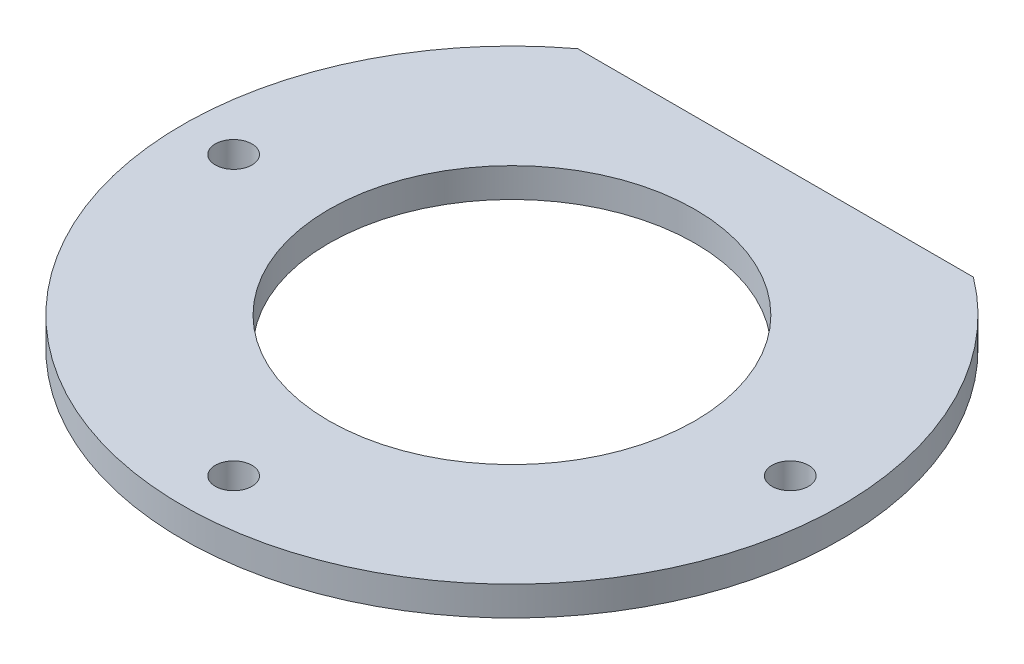
ISO-10303-21;
HEADER;
FILE_DESCRIPTION(('STEP AP214'),'2;1');
FILE_NAME('part.step','',(''),(''),'','','');
FILE_SCHEMA(('AUTOMOTIVE_DESIGN { 1 0 10303 214 1 1 1 1 }'));
ENDSEC;
DATA;
#1=APPLICATION_CONTEXT('core data for automotive mechanical design processes');
#2=APPLICATION_PROTOCOL_DEFINITION('international standard','automotive_design',2000,#1);
#3=PRODUCT_CONTEXT('',#1,'mechanical');
#4=PRODUCT('Part','Part','',(#3));
#5=PRODUCT_RELATED_PRODUCT_CATEGORY('part','',(#4));
#6=PRODUCT_DEFINITION_FORMATION('','',#4);
#7=PRODUCT_DEFINITION_CONTEXT('part definition',#1,'design');
#8=PRODUCT_DEFINITION('design','',#6,#7);
#9=PRODUCT_DEFINITION_SHAPE('','',#8);
#10=(LENGTH_UNIT() NAMED_UNIT(*) SI_UNIT(.MILLI.,.METRE.));
#11=(NAMED_UNIT(*) PLANE_ANGLE_UNIT() SI_UNIT($,.RADIAN.));
#12=(NAMED_UNIT(*) SI_UNIT($,.STERADIAN.) SOLID_ANGLE_UNIT());
#13=UNCERTAINTY_MEASURE_WITH_UNIT(LENGTH_MEASURE(1.E-05),#10,'distance_accuracy_value','');
#14=(GEOMETRIC_REPRESENTATION_CONTEXT(3) GLOBAL_UNCERTAINTY_ASSIGNED_CONTEXT((#13)) GLOBAL_UNIT_ASSIGNED_CONTEXT((#10,
#11,#12)) REPRESENTATION_CONTEXT('',''));
#15=CARTESIAN_POINT('',(0.,0.,0.));
#16=DIRECTION('',(0.,0.,1.));
#17=DIRECTION('',(1.,0.,0.));
#18=AXIS2_PLACEMENT_3D('',#15,#16,#17);
#19=CARTESIAN_POINT('',(0.,2.,0.));
#20=DIRECTION('',(0.,1.,0.));
#21=DIRECTION('',(0.,0.,1.));
#22=AXIS2_PLACEMENT_3D('',#19,#20,#21);
#23=PLANE('',#22);
#24=CARTESIAN_POINT('',(0.,2.,19.));
#25=DIRECTION('',(0.,1.,0.));
#26=DIRECTION('',(0.,0.,1.));
#27=AXIS2_PLACEMENT_3D('',#24,#25,#26);
#28=CIRCLE('',#27,1.25);
#29=CARTESIAN_POINT('',(0.,2.,20.25));
#30=VERTEX_POINT('',#29);
#31=EDGE_CURVE('E91',#30,#30,#28,.T.);
#32=ORIENTED_EDGE('',*,*,#31,.F.);
#33=EDGE_LOOP('',(#32));
#34=FACE_BOUND('',#33,.T.);
#35=CARTESIAN_POINT('',(19.,2.,0.));
#36=DIRECTION('',(0.,1.,0.));
#37=DIRECTION('',(0.,0.,1.));
#38=AXIS2_PLACEMENT_3D('',#35,#36,#37);
#39=CIRCLE('',#38,1.25);
#40=CARTESIAN_POINT('',(19.,2.,1.24999999999999));
#41=VERTEX_POINT('',#40);
#42=EDGE_CURVE('E85',#41,#41,#39,.T.);
#43=ORIENTED_EDGE('',*,*,#42,.F.);
#44=EDGE_LOOP('',(#43));
#45=FACE_BOUND('',#44,.T.);
#46=CARTESIAN_POINT('',(-19.,2.,0.));
#47=DIRECTION('',(0.,1.,0.));
#48=DIRECTION('',(0.,0.,1.));
#49=AXIS2_PLACEMENT_3D('',#46,#47,#48);
#50=CIRCLE('',#49,1.25);
#51=CARTESIAN_POINT('',(-19.,2.,1.24999999999999));
#52=VERTEX_POINT('',#51);
#53=EDGE_CURVE('E79',#52,#52,#50,.T.);
#54=ORIENTED_EDGE('',*,*,#53,.F.);
#55=EDGE_LOOP('',(#54));
#56=FACE_BOUND('',#55,.T.);
#57=DIRECTION('',(1.,0.,0.));
#58=VECTOR('',#57,1.);
#59=CARTESIAN_POINT('',(-20.2349359796307,2.,-18.));
#60=LINE('',#59,#58);
#61=CARTESIAN_POINT('',(-13.5,2.,-18.));
#62=VERTEX_POINT('',#61);
#63=CARTESIAN_POINT('',(13.5,2.,-18.));
#64=VERTEX_POINT('',#63);
#65=EDGE_CURVE('E48',#62,#64,#60,.T.);
#66=ORIENTED_EDGE('',*,*,#65,.F.);
#67=CARTESIAN_POINT('',(0.,2.,0.));
#68=DIRECTION('',(0.,1.,0.));
#69=DIRECTION('',(0.,0.,1.));
#70=AXIS2_PLACEMENT_3D('',#67,#68,#69);
#71=CIRCLE('',#70,22.5);
#72=EDGE_CURVE('E65',#62,#64,#71,.T.);
#73=ORIENTED_EDGE('',*,*,#72,.T.);
#74=EDGE_LOOP('',(#66,#73));
#75=FACE_BOUND('',#74,.T.);
#76=CARTESIAN_POINT('',(0.,2.,0.));
#77=DIRECTION('',(0.,1.,0.));
#78=DIRECTION('',(0.,0.,1.));
#79=AXIS2_PLACEMENT_3D('',#76,#77,#78);
#80=CIRCLE('',#79,12.5);
#81=CARTESIAN_POINT('',(0.,2.,12.5));
#82=VERTEX_POINT('',#81);
#83=EDGE_CURVE('E70',#82,#82,#80,.T.);
#84=ORIENTED_EDGE('',*,*,#83,.F.);
#85=EDGE_LOOP('',(#84));
#86=FACE_BOUND('',#85,.T.);
#87=ADVANCED_FACE('F33',(#34,#45,#56,#75,#86),#23,.T.);
#88=CARTESIAN_POINT('',(0.,0.,0.));
#89=DIRECTION('',(0.,1.,0.));
#90=DIRECTION('',(0.,0.,1.));
#91=AXIS2_PLACEMENT_3D('',#88,#89,#90);
#92=PLANE('',#91);
#93=CARTESIAN_POINT('',(0.,0.,19.));
#94=DIRECTION('',(0.,1.,0.));
#95=DIRECTION('',(0.,0.,1.));
#96=AXIS2_PLACEMENT_3D('',#93,#94,#95);
#97=CIRCLE('',#96,1.25);
#98=CARTESIAN_POINT('',(0.,0.,20.25));
#99=VERTEX_POINT('',#98);
#100=EDGE_CURVE('E88',#99,#99,#97,.T.);
#101=ORIENTED_EDGE('',*,*,#100,.T.);
#102=EDGE_LOOP('',(#101));
#103=FACE_BOUND('',#102,.T.);
#104=CARTESIAN_POINT('',(19.,0.,0.));
#105=DIRECTION('',(0.,1.,0.));
#106=DIRECTION('',(0.,0.,1.));
#107=AXIS2_PLACEMENT_3D('',#104,#105,#106);
#108=CIRCLE('',#107,1.25);
#109=CARTESIAN_POINT('',(19.,0.,1.24999999999999));
#110=VERTEX_POINT('',#109);
#111=EDGE_CURVE('E82',#110,#110,#108,.T.);
#112=ORIENTED_EDGE('',*,*,#111,.T.);
#113=EDGE_LOOP('',(#112));
#114=FACE_BOUND('',#113,.T.);
#115=CARTESIAN_POINT('',(-19.,0.,0.));
#116=DIRECTION('',(0.,1.,0.));
#117=DIRECTION('',(0.,0.,1.));
#118=AXIS2_PLACEMENT_3D('',#115,#116,#117);
#119=CIRCLE('',#118,1.25);
#120=CARTESIAN_POINT('',(-19.,0.,1.24999999999999));
#121=VERTEX_POINT('',#120);
#122=EDGE_CURVE('E66',#121,#121,#119,.T.);
#123=ORIENTED_EDGE('',*,*,#122,.T.);
#124=EDGE_LOOP('',(#123));
#125=FACE_BOUND('',#124,.T.);
#126=CARTESIAN_POINT('',(0.,0.,0.));
#127=DIRECTION('',(0.,1.,0.));
#128=DIRECTION('',(0.,0.,1.));
#129=AXIS2_PLACEMENT_3D('',#126,#127,#128);
#130=CIRCLE('',#129,22.5);
#131=CARTESIAN_POINT('',(-13.5,0.,-18.));
#132=VERTEX_POINT('',#131);
#133=CARTESIAN_POINT('',(13.5,0.,-18.));
#134=VERTEX_POINT('',#133);
#135=EDGE_CURVE('E68',#132,#134,#130,.T.);
#136=ORIENTED_EDGE('',*,*,#135,.F.);
#137=DIRECTION('',(1.,0.,0.));
#138=VECTOR('',#137,1.);
#139=CARTESIAN_POINT('',(-20.2349359796307,0.,-18.));
#140=LINE('',#139,#138);
#141=EDGE_CURVE('E57',#132,#134,#140,.T.);
#142=ORIENTED_EDGE('',*,*,#141,.T.);
#143=EDGE_LOOP('',(#136,#142));
#144=FACE_BOUND('',#143,.T.);
#145=CARTESIAN_POINT('',(0.,0.,0.));
#146=DIRECTION('',(0.,1.,0.));
#147=DIRECTION('',(0.,0.,1.));
#148=AXIS2_PLACEMENT_3D('',#145,#146,#147);
#149=CIRCLE('',#148,12.5);
#150=CARTESIAN_POINT('',(0.,0.,12.5));
#151=VERTEX_POINT('',#150);
#152=EDGE_CURVE('E73',#151,#151,#149,.T.);
#153=ORIENTED_EDGE('',*,*,#152,.T.);
#154=EDGE_LOOP('',(#153));
#155=FACE_BOUND('',#154,.T.);
#156=ADVANCED_FACE('F97',(#103,#114,#125,#144,#155),#92,.F.);
#157=CARTESIAN_POINT('',(0.,2.,0.));
#158=DIRECTION('',(0.,-1.,0.));
#159=DIRECTION('',(0.,0.,-1.));
#160=AXIS2_PLACEMENT_3D('',#157,#158,#159);
#161=CYLINDRICAL_SURFACE('',#160,22.5);
#162=ORIENTED_EDGE('',*,*,#72,.F.);
#163=DIRECTION('',(0.,-1.,0.));
#164=VECTOR('',#163,1.);
#165=CARTESIAN_POINT('',(-13.5,2.,-18.));
#166=LINE('',#165,#164);
#167=EDGE_CURVE('E11',#62,#132,#166,.T.);
#168=ORIENTED_EDGE('',*,*,#167,.T.);
#169=ORIENTED_EDGE('',*,*,#135,.T.);
#170=DIRECTION('',(0.,-1.,0.));
#171=VECTOR('',#170,1.);
#172=CARTESIAN_POINT('',(13.5,2.,-18.));
#173=LINE('',#172,#171);
#174=EDGE_CURVE('E41',#134,#64,#173,.F.);
#175=ORIENTED_EDGE('',*,*,#174,.T.);
#176=EDGE_LOOP('',(#162,#168,#169,#175));
#177=FACE_BOUND('',#176,.T.);
#178=ADVANCED_FACE('F35',(#177),#161,.T.);
#179=CARTESIAN_POINT('',(0.,2.,0.));
#180=DIRECTION('',(0.,-1.,0.));
#181=DIRECTION('',(0.,0.,-1.));
#182=AXIS2_PLACEMENT_3D('',#179,#180,#181);
#183=CYLINDRICAL_SURFACE('',#182,12.5);
#184=ORIENTED_EDGE('',*,*,#83,.T.);
#185=EDGE_LOOP('',(#184));
#186=FACE_BOUND('',#185,.T.);
#187=ORIENTED_EDGE('',*,*,#152,.F.);
#188=EDGE_LOOP('',(#187));
#189=FACE_BOUND('',#188,.T.);
#190=ADVANCED_FACE('F124',(#186,#189),#183,.F.);
#191=CARTESIAN_POINT('',(-20.2349359796307,0.,-18.));
#192=DIRECTION('',(0.,0.,1.));
#193=DIRECTION('',(1.,0.,0.));
#194=AXIS2_PLACEMENT_3D('',#191,#192,#193);
#195=PLANE('',#194);
#196=ORIENTED_EDGE('',*,*,#65,.T.);
#197=ORIENTED_EDGE('',*,*,#174,.F.);
#198=ORIENTED_EDGE('',*,*,#141,.F.);
#199=ORIENTED_EDGE('',*,*,#167,.F.);
#200=EDGE_LOOP('',(#196,#197,#198,#199));
#201=FACE_BOUND('',#200,.T.);
#202=ADVANCED_FACE('F56',(#201),#195,.F.);
#203=CARTESIAN_POINT('',(-19.,0.,0.));
#204=DIRECTION('',(0.,1.,0.));
#205=DIRECTION('',(0.,0.,1.));
#206=AXIS2_PLACEMENT_3D('',#203,#204,#205);
#207=CYLINDRICAL_SURFACE('',#206,1.25);
#208=ORIENTED_EDGE('',*,*,#122,.F.);
#209=EDGE_LOOP('',(#208));
#210=FACE_BOUND('',#209,.T.);
#211=ORIENTED_EDGE('',*,*,#53,.T.);
#212=EDGE_LOOP('',(#211));
#213=FACE_BOUND('',#212,.T.);
#214=ADVANCED_FACE('F114',(#210,#213),#207,.F.);
#215=CARTESIAN_POINT('',(19.,0.,0.));
#216=DIRECTION('',(0.,1.,0.));
#217=DIRECTION('',(0.,0.,1.));
#218=AXIS2_PLACEMENT_3D('',#215,#216,#217);
#219=CYLINDRICAL_SURFACE('',#218,1.25);
#220=ORIENTED_EDGE('',*,*,#111,.F.);
#221=EDGE_LOOP('',(#220));
#222=FACE_BOUND('',#221,.T.);
#223=ORIENTED_EDGE('',*,*,#42,.T.);
#224=EDGE_LOOP('',(#223));
#225=FACE_BOUND('',#224,.T.);
#226=ADVANCED_FACE('F103',(#222,#225),#219,.F.);
#227=CARTESIAN_POINT('',(0.,0.,19.));
#228=DIRECTION('',(0.,1.,0.));
#229=DIRECTION('',(0.,0.,1.));
#230=AXIS2_PLACEMENT_3D('',#227,#228,#229);
#231=CYLINDRICAL_SURFACE('',#230,1.25);
#232=ORIENTED_EDGE('',*,*,#100,.F.);
#233=EDGE_LOOP('',(#232));
#234=FACE_BOUND('',#233,.T.);
#235=ORIENTED_EDGE('',*,*,#31,.T.);
#236=EDGE_LOOP('',(#235));
#237=FACE_BOUND('',#236,.T.);
#238=ADVANCED_FACE('F100',(#234,#237),#231,.F.);
#239=CLOSED_SHELL('',(#87,#156,#178,#190,#202,#214,#226,#238));
#240=MANIFOLD_SOLID_BREP('B2',#239);
#241=ADVANCED_BREP_SHAPE_REPRESENTATION('',(#18,#240),#14);
#242=SHAPE_DEFINITION_REPRESENTATION(#9,#241);
ENDSEC;
END-ISO-10303-21;
